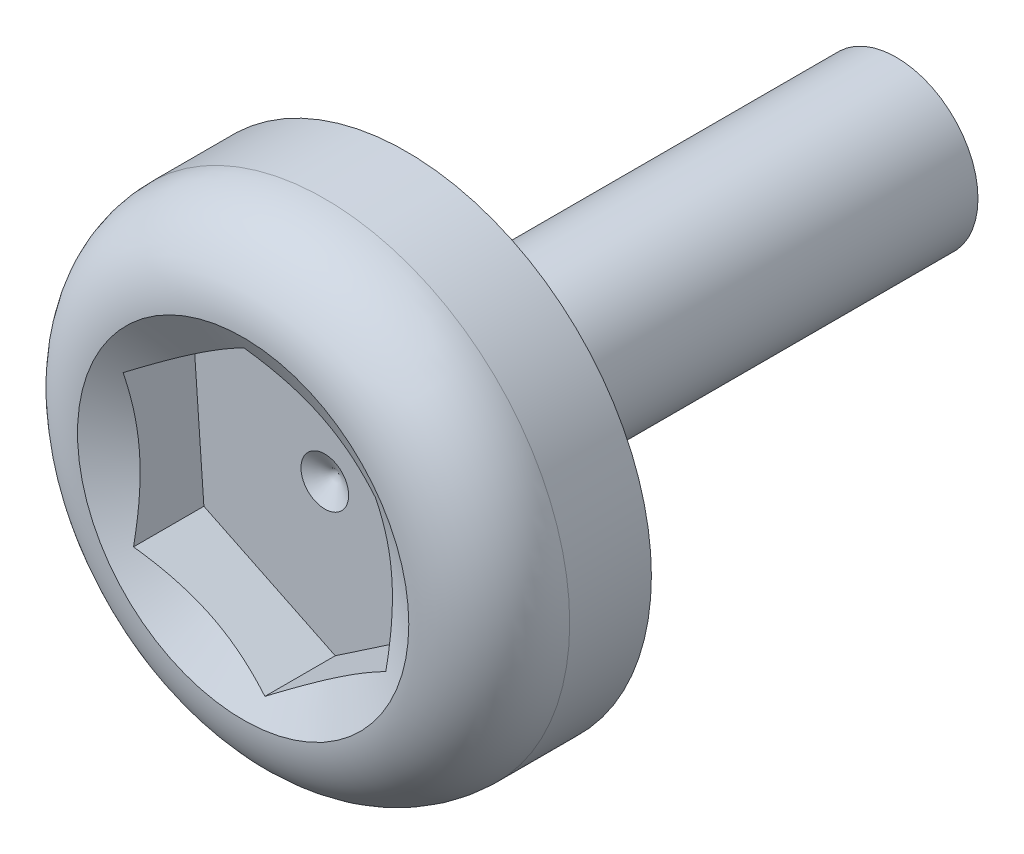
ISO-10303-21;
HEADER;
FILE_DESCRIPTION(('STEP AP214'),'2;1');
FILE_NAME('part.step','',(''),(''),'','','');
FILE_SCHEMA(('AUTOMOTIVE_DESIGN { 1 0 10303 214 1 1 1 1 }'));
ENDSEC;
DATA;
#1=APPLICATION_CONTEXT('core data for automotive mechanical design processes');
#2=APPLICATION_PROTOCOL_DEFINITION('international standard','automotive_design',2000,#1);
#3=PRODUCT_CONTEXT('',#1,'mechanical');
#4=PRODUCT('Part','Part','',(#3));
#5=PRODUCT_RELATED_PRODUCT_CATEGORY('part','',(#4));
#6=PRODUCT_DEFINITION_FORMATION('','',#4);
#7=PRODUCT_DEFINITION_CONTEXT('part definition',#1,'design');
#8=PRODUCT_DEFINITION('design','',#6,#7);
#9=PRODUCT_DEFINITION_SHAPE('','',#8);
#10=(LENGTH_UNIT() NAMED_UNIT(*) SI_UNIT(.MILLI.,.METRE.));
#11=(NAMED_UNIT(*) PLANE_ANGLE_UNIT() SI_UNIT($,.RADIAN.));
#12=(NAMED_UNIT(*) SI_UNIT($,.STERADIAN.) SOLID_ANGLE_UNIT());
#13=UNCERTAINTY_MEASURE_WITH_UNIT(LENGTH_MEASURE(1.E-05),#10,'distance_accuracy_value','');
#14=(GEOMETRIC_REPRESENTATION_CONTEXT(3) GLOBAL_UNCERTAINTY_ASSIGNED_CONTEXT((#13)) GLOBAL_UNIT_ASSIGNED_CONTEXT((#10,
#11,#12)) REPRESENTATION_CONTEXT('',''));
#15=CARTESIAN_POINT('',(0.,0.,0.));
#16=DIRECTION('',(0.,0.,1.));
#17=DIRECTION('',(1.,0.,0.));
#18=AXIS2_PLACEMENT_3D('',#15,#16,#17);
#19=CARTESIAN_POINT('',(0.,0.,3.));
#20=DIRECTION('',(0.,0.,-1.));
#21=DIRECTION('',(-1.,0.,0.));
#22=AXIS2_PLACEMENT_3D('',#19,#20,#21);
#23=CYLINDRICAL_SURFACE('',#22,0.5);
#24=CARTESIAN_POINT('',(0.,0.,3.));
#25=DIRECTION('',(0.,0.,1.));
#26=DIRECTION('',(1.,0.,0.));
#27=AXIS2_PLACEMENT_3D('',#24,#25,#26);
#28=CIRCLE('',#27,0.5);
#29=CARTESIAN_POINT('',(0.5,0.,3.));
#30=VERTEX_POINT('',#29);
#31=EDGE_CURVE('E139',#30,#30,#28,.T.);
#32=ORIENTED_EDGE('',*,*,#31,.F.);
#33=EDGE_LOOP('',(#32));
#34=FACE_BOUND('',#33,.T.);
#35=CARTESIAN_POINT('',(0.,0.,0.));
#36=DIRECTION('',(0.,0.,1.));
#37=DIRECTION('',(1.,0.,0.));
#38=AXIS2_PLACEMENT_3D('',#35,#36,#37);
#39=CIRCLE('',#38,0.5);
#40=CARTESIAN_POINT('',(0.5,0.,0.));
#41=VERTEX_POINT('',#40);
#42=EDGE_CURVE('E138',#41,#41,#39,.T.);
#43=ORIENTED_EDGE('',*,*,#42,.T.);
#44=EDGE_LOOP('',(#43));
#45=FACE_BOUND('',#44,.T.);
#46=ADVANCED_FACE('F35',(#34,#45),#23,.T.);
#47=CARTESIAN_POINT('',(0.,0.,0.));
#48=DIRECTION('',(0.,0.,1.));
#49=DIRECTION('',(1.,0.,0.));
#50=AXIS2_PLACEMENT_3D('',#47,#48,#49);
#51=PLANE('',#50);
#52=ORIENTED_EDGE('',*,*,#42,.F.);
#53=EDGE_LOOP('',(#52));
#54=FACE_BOUND('',#53,.T.);
#55=ADVANCED_FACE('F215',(#54),#51,.F.);
#56=CARTESIAN_POINT('',(0.,0.,4.));
#57=DIRECTION('',(0.,0.,-1.));
#58=DIRECTION('',(-1.,0.,0.));
#59=AXIS2_PLACEMENT_3D('',#56,#57,#58);
#60=CYLINDRICAL_SURFACE('',#59,1.5);
#61=CARTESIAN_POINT('',(0.,0.,3.50020646711625));
#62=DIRECTION('',(0.,0.,1.));
#63=DIRECTION('',(1.,0.,0.));
#64=AXIS2_PLACEMENT_3D('',#61,#62,#63);
#65=CIRCLE('',#64,1.5);
#66=CARTESIAN_POINT('',(1.5,0.,3.50020646711625));
#67=VERTEX_POINT('',#66);
#68=EDGE_CURVE('E11',#67,#67,#65,.F.);
#69=ORIENTED_EDGE('',*,*,#68,.T.);
#70=EDGE_LOOP('',(#69));
#71=FACE_BOUND('',#70,.T.);
#72=CARTESIAN_POINT('',(0.,0.,3.));
#73=DIRECTION('',(0.,0.,1.));
#74=DIRECTION('',(1.,0.,0.));
#75=AXIS2_PLACEMENT_3D('',#72,#73,#74);
#76=CIRCLE('',#75,1.5);
#77=CARTESIAN_POINT('',(1.5,0.,3.));
#78=VERTEX_POINT('',#77);
#79=EDGE_CURVE('E135',#78,#78,#76,.T.);
#80=ORIENTED_EDGE('',*,*,#79,.T.);
#81=EDGE_LOOP('',(#80));
#82=FACE_BOUND('',#81,.T.);
#83=ADVANCED_FACE('F220',(#71,#82),#60,.T.);
#84=CARTESIAN_POINT('',(0.,0.,3.));
#85=DIRECTION('',(0.,0.,1.));
#86=DIRECTION('',(1.,0.,0.));
#87=AXIS2_PLACEMENT_3D('',#84,#85,#86);
#88=PLANE('',#87);
#89=ORIENTED_EDGE('',*,*,#31,.T.);
#90=EDGE_LOOP('',(#89));
#91=FACE_BOUND('',#90,.T.);
#92=ORIENTED_EDGE('',*,*,#79,.F.);
#93=EDGE_LOOP('',(#92));
#94=FACE_BOUND('',#93,.T.);
#95=ADVANCED_FACE('F227',(#91,#94),#88,.F.);
#96=CARTESIAN_POINT('',(0.,0.,4.));
#97=DIRECTION('',(0.,0.,1.));
#98=DIRECTION('',(1.,0.,0.));
#99=AXIS2_PLACEMENT_3D('',#96,#97,#98);
#100=CONICAL_SURFACE('',#99,1.01436748020978,1.04833196437632);
#101=CARTESIAN_POINT('',(-0.804745672472296,0.390392042808868,3.93094067405796));
#102=CARTESIAN_POINT('',(-0.772210209193432,0.412426837229242,3.9196190794136));
#103=CARTESIAN_POINT('',(-0.739395377490517,0.434650835219233,3.90932209945797));
#104=CARTESIAN_POINT('',(-0.673200366959959,0.479481715179159,3.89134669596215));
#105=CARTESIAN_POINT('',(-0.63981902397018,0.502089385583337,3.8836745923592));
#106=CARTESIAN_POINT('',(-0.573467930373446,0.547025973528614,3.87172704806451));
#107=CARTESIAN_POINT('',(-0.540508291496563,0.569348042853309,3.86737260444981));
#108=CARTESIAN_POINT('',(-0.474434211263221,0.614097022204797,3.86216712532911));
#109=CARTESIAN_POINT('',(-0.441320008041255,0.636523770953892,3.86131181890466));
#110=CARTESIAN_POINT('',(-0.379404400696574,0.678456405124771,3.86305793228767));
#111=CARTESIAN_POINT('',(-0.350593947288411,0.697968419217376,3.86523055810879));
#112=CARTESIAN_POINT('',(-0.293159743178299,0.736866002123049,3.87212719387366));
#113=CARTESIAN_POINT('',(-0.26453618950403,0.756251437498201,3.87685355855707));
#114=CARTESIAN_POINT('',(-0.206983593076056,0.795229202153945,3.88867323667547));
#115=CARTESIAN_POINT('',(-0.178061778863407,0.814816635871355,3.895816550869));
#116=CARTESIAN_POINT('',(-0.12064792436806,0.853700436905412,3.91203170981139));
#117=CARTESIAN_POINT('',(-0.0921551538036412,0.872997298808765,3.92109975318976));
#118=CARTESIAN_POINT('',(-0.0638661057786929,0.892156188671039,3.93094067405796));
#119=B_SPLINE_CURVE_WITH_KNOTS('',3,(#101,#102,#103,#104,#105,#106,#107,#108,#109,#110,#111,
#112,#113,#114,#115,#116,#117,#118),.UNSPECIFIED.,.F.,.F.,(4,2,2,2,2,2,2,2,4),(0.,
0.122727997722935,0.245749442791075,0.365740979837626,0.485586015843046,0.590078066125219,
0.694666630787033,0.801566583095681,0.908257338842893),.UNSPECIFIED.);
#120=CARTESIAN_POINT('',(-0.804545672472296,0.39052749374271,3.93087111272209));
#121=VERTEX_POINT('',#120);
#122=CARTESIAN_POINT('',(-0.0640661057786928,0.892020737737198,3.93087111272209));
#123=VERTEX_POINT('',#122);
#124=EDGE_CURVE('E142',#121,#123,#119,.T.);
#125=ORIENTED_EDGE('',*,*,#124,.T.);
#126=CARTESIAN_POINT('',(-0.0642661057786929,0.892117817991832,3.93093513384495));
#127=CARTESIAN_POINT('',(-0.0289159749355394,0.874958819473785,3.91961399409971));
#128=CARTESIAN_POINT('',(0.00673769333866236,0.857652483500251,3.90931749724551));
#129=CARTESIAN_POINT('',(0.078659261984637,0.822741662511001,3.89134309627893));
#130=CARTESIAN_POINT('',(0.114928427056512,0.805136563608243,3.88367151147802));
#131=CARTESIAN_POINT('',(0.187019566682485,0.770143432649409,3.87172499283061));
#132=CARTESIAN_POINT('',(0.222830555914973,0.752760732882426,3.86737105917464));
#133=CARTESIAN_POINT('',(0.294620694767772,0.717913708082116,3.86216656570991));
#134=CARTESIAN_POINT('',(0.330599585721433,0.700449508605908,3.86131173539684));
#135=CARTESIAN_POINT('',(0.397869191554946,0.667796756288573,3.86305860240214));
#136=CARTESIAN_POINT('',(0.429169747552977,0.652603426556152,3.86523132118362));
#137=CARTESIAN_POINT('',(0.491568023855657,0.622315223795121,3.87212770835052));
#138=CARTESIAN_POINT('',(0.522665530167099,0.607220454639087,3.87685373048648));
#139=CARTESIAN_POINT('',(0.585192390055117,0.576869837242024,3.88867233860326));
#140=CARTESIAN_POINT('',(0.616613891926977,0.561617800228461,3.89581491160597));
#141=CARTESIAN_POINT('',(0.678990026406465,0.531340345136598,3.91202830623598));
#142=CARTESIAN_POINT('',(0.709945452168426,0.516314542060175,3.92109532788825));
#143=CARTESIAN_POINT('',(0.740679566693603,0.501396163739854,3.93093513384495));
#144=B_SPLINE_CURVE_WITH_KNOTS('',3,(#126,#127,#128,#129,#130,#131,#132,#133,#134,#135,#136,
#137,#138,#139,#140,#141,#142,#143),.UNSPECIFIED.,.F.,.F.,(4,2,2,2,2,2,2,2,4),(0.,
0.122726680686221,0.24574677291457,0.365737118144795,0.485580976605771,0.590064515948094,
0.694644537699565,0.801535496687152,0.908217322661252),.UNSPECIFIED.);
#145=CARTESIAN_POINT('',(0.740479566693603,0.501493243994488,3.93087111272209));
#146=VERTEX_POINT('',#145);
#147=EDGE_CURVE('E43',#123,#146,#144,.T.);
#148=ORIENTED_EDGE('',*,*,#147,.T.);
#149=CARTESIAN_POINT('',(0.740465202429843,0.501693243994488,3.93092885462633));
#150=CARTESIAN_POINT('',(0.743280112829839,0.462500000997302,3.91960823047951));
#151=CARTESIAN_POINT('',(0.74611919379633,0.422970220508164,3.90931228118956));
#152=CARTESIAN_POINT('',(0.751846264541374,0.343229680499159,3.89133901652285));
#153=CARTESIAN_POINT('',(0.754734355011505,0.303017519005892,3.88366801974832));
#154=CARTESIAN_POINT('',(0.760474927245606,0.223088991790803,3.87172266359843));
#155=CARTESIAN_POINT('',(0.763326534361464,0.183384804181662,3.86736930794272));
#156=CARTESIAN_POINT('',(0.769043136023048,0.103790029853865,3.86216593164029));
#157=CARTESIAN_POINT('',(0.77190810997753,0.0638997298362158,3.86131164095867));
#158=CARTESIAN_POINT('',(0.777264535952246,-0.0106801590383515,3.86305936205839));
#159=CARTESIAN_POINT('',(0.77975677242515,-0.0453806701768752,3.86523218614936));
#160=CARTESIAN_POINT('',(0.784725095379882,-0.114556828982372,3.87212829148486));
#161=CARTESIAN_POINT('',(0.787201164828728,-0.149032239491592,3.87685392535918));
#162=CARTESIAN_POINT('',(0.792179722222949,-0.218350896926474,3.8886713207236));
#163=CARTESIAN_POINT('',(0.794681585138612,-0.253185441286887,3.89581305366917));
#164=CARTESIAN_POINT('',(0.799648142088259,-0.322337011222197,3.91202444865305));
#165=CARTESIAN_POINT('',(0.802112899253178,-0.35665491579703,3.92109031229756));
#166=CARTESIAN_POINT('',(0.804560036736056,-0.39072749374271,3.93092885462633));
#167=B_SPLINE_CURVE_WITH_KNOTS('',3,(#149,#150,#151,#152,#153,#154,#155,#156,#157,#158,#159,
#160,#161,#162,#163,#164,#165,#166),.UNSPECIFIED.,.F.,.F.,(4,2,2,2,2,2,2,2,4),(0.,
0.122725187967656,0.245743746898525,0.365732741337621,0.485575265182602,0.590049157934113,
0.694619496865939,0.80150026258464,0.90817196730253),.UNSPECIFIED.);
#168=CARTESIAN_POINT('',(0.804545672472296,-0.39052749374271,3.93087111272209));
#169=VERTEX_POINT('',#168);
#170=EDGE_CURVE('E175',#146,#169,#167,.T.);
#171=ORIENTED_EDGE('',*,*,#170,.T.);
#172=CARTESIAN_POINT('',(0.804745672472296,-0.390392042808868,3.93094067405796));
#173=CARTESIAN_POINT('',(0.772210209193432,-0.412426837229242,3.9196190794136));
#174=CARTESIAN_POINT('',(0.739395377490517,-0.434650835219233,3.90932209945797));
#175=CARTESIAN_POINT('',(0.67320036695996,-0.479481715179159,3.89134669596216));
#176=CARTESIAN_POINT('',(0.63981902397018,-0.502089385583337,3.8836745923592));
#177=CARTESIAN_POINT('',(0.573467930373446,-0.547025973528614,3.87172704806451));
#178=CARTESIAN_POINT('',(0.540508291496563,-0.569348042853309,3.86737260444981));
#179=CARTESIAN_POINT('',(0.474434211263221,-0.614097022204798,3.86216712532911));
#180=CARTESIAN_POINT('',(0.441320008041255,-0.636523770953893,3.86131181890467));
#181=CARTESIAN_POINT('',(0.379404400696574,-0.678456405124771,3.86305793228767));
#182=CARTESIAN_POINT('',(0.350593947288411,-0.697968419217376,3.86523055810879));
#183=CARTESIAN_POINT('',(0.293159743178299,-0.736866002123049,3.87212719387366));
#184=CARTESIAN_POINT('',(0.26453618950403,-0.756251437498201,3.87685355855707));
#185=CARTESIAN_POINT('',(0.206983593076056,-0.795229202153945,3.88867323667547));
#186=CARTESIAN_POINT('',(0.178061778863407,-0.814816635871355,3.895816550869));
#187=CARTESIAN_POINT('',(0.12064792436806,-0.853700436905412,3.9120317098114));
#188=CARTESIAN_POINT('',(0.0921551538036412,-0.872997298808765,3.92109975318976));
#189=CARTESIAN_POINT('',(0.0638661057786931,-0.892156188671039,3.93094067405796));
#190=B_SPLINE_CURVE_WITH_KNOTS('',3,(#172,#173,#174,#175,#176,#177,#178,#179,#180,#181,#182,
#183,#184,#185,#186,#187,#188,#189),.UNSPECIFIED.,.F.,.F.,(4,2,2,2,2,2,2,2,4),(0.,
0.122727997722935,0.245749442791075,0.365740979837626,0.485586015843046,0.59007806612522,
0.694666630787033,0.801566583095681,0.908257338842892),.UNSPECIFIED.);
#191=CARTESIAN_POINT('',(0.0640661057786931,-0.892020737737198,3.93087111272209));
#192=VERTEX_POINT('',#191);
#193=EDGE_CURVE('E182',#169,#192,#190,.T.);
#194=ORIENTED_EDGE('',*,*,#193,.T.);
#195=CARTESIAN_POINT('',(0.0642661057786931,-0.892117817991832,3.93093513384495));
#196=CARTESIAN_POINT('',(0.0289159749355395,-0.874958819473785,3.91961399409971));
#197=CARTESIAN_POINT('',(-0.00673769333866229,-0.857652483500251,3.90931749724551));
#198=CARTESIAN_POINT('',(-0.0786592619846369,-0.822741662511,3.89134309627893));
#199=CARTESIAN_POINT('',(-0.114928427056512,-0.805136563608243,3.88367151147802));
#200=CARTESIAN_POINT('',(-0.187019566682484,-0.770143432649409,3.87172499283061));
#201=CARTESIAN_POINT('',(-0.222830555914973,-0.752760732882426,3.86737105917464));
#202=CARTESIAN_POINT('',(-0.294620694767771,-0.717913708082116,3.8621665657099));
#203=CARTESIAN_POINT('',(-0.330599585721433,-0.700449508605908,3.86131173539684));
#204=CARTESIAN_POINT('',(-0.397869191554946,-0.667796756288573,3.86305860240214));
#205=CARTESIAN_POINT('',(-0.429169747552976,-0.652603426556152,3.86523132118362));
#206=CARTESIAN_POINT('',(-0.491568023855657,-0.622315223795121,3.87212770835052));
#207=CARTESIAN_POINT('',(-0.522665530167099,-0.607220454639087,3.87685373048648));
#208=CARTESIAN_POINT('',(-0.585192390055117,-0.576869837242024,3.88867233860326));
#209=CARTESIAN_POINT('',(-0.616613891926977,-0.561617800228461,3.89581491160597));
#210=CARTESIAN_POINT('',(-0.678990026406465,-0.531340345136598,3.91202830623598));
#211=CARTESIAN_POINT('',(-0.709945452168426,-0.516314542060175,3.92109532788825));
#212=CARTESIAN_POINT('',(-0.740679566693603,-0.501396163739854,3.93093513384495));
#213=B_SPLINE_CURVE_WITH_KNOTS('',3,(#195,#196,#197,#198,#199,#200,#201,#202,#203,#204,#205,
#206,#207,#208,#209,#210,#211,#212),.UNSPECIFIED.,.F.,.F.,(4,2,2,2,2,2,2,2,4),(0.,
0.122726680686222,0.24574677291457,0.365737118144795,0.48558097660577,0.590064515948094,
0.694644537699565,0.801535496687153,0.908217322661253),.UNSPECIFIED.);
#214=CARTESIAN_POINT('',(-0.740479566693603,-0.501493243994488,3.93087111272209));
#215=VERTEX_POINT('',#214);
#216=EDGE_CURVE('E199',#192,#215,#213,.T.);
#217=ORIENTED_EDGE('',*,*,#216,.T.);
#218=CARTESIAN_POINT('',(-0.740465202429844,-0.501693243994488,3.93092885462633));
#219=CARTESIAN_POINT('',(-0.743280112829839,-0.462500000997302,3.9196082304795));
#220=CARTESIAN_POINT('',(-0.746119193796331,-0.422970220508163,3.90931228118956));
#221=CARTESIAN_POINT('',(-0.751846264541374,-0.343229680499159,3.89133901652285));
#222=CARTESIAN_POINT('',(-0.754734355011505,-0.303017519005891,3.88366801974832));
#223=CARTESIAN_POINT('',(-0.760474927245606,-0.223088991790803,3.87172266359842));
#224=CARTESIAN_POINT('',(-0.763326534361464,-0.183384804181662,3.86736930794272));
#225=CARTESIAN_POINT('',(-0.769043136023048,-0.103790029853865,3.86216593164029));
#226=CARTESIAN_POINT('',(-0.77190810997753,-0.0638997298362159,3.86131164095867));
#227=CARTESIAN_POINT('',(-0.777264535952246,0.0106801590383513,3.86305936205839));
#228=CARTESIAN_POINT('',(-0.77975677242515,0.0453806701768751,3.86523218614936));
#229=CARTESIAN_POINT('',(-0.784725095379882,0.114556828982372,3.87212829148486));
#230=CARTESIAN_POINT('',(-0.787201164828728,0.149032239491592,3.87685392535918));
#231=CARTESIAN_POINT('',(-0.792179722222949,0.218350896926474,3.8886713207236));
#232=CARTESIAN_POINT('',(-0.794681585138612,0.253185441286887,3.89581305366917));
#233=CARTESIAN_POINT('',(-0.799648142088259,0.322337011222196,3.91202444865305));
#234=CARTESIAN_POINT('',(-0.802112899253178,0.35665491579703,3.92109031229756));
#235=CARTESIAN_POINT('',(-0.804560036736056,0.39072749374271,3.93092885462633));
#236=B_SPLINE_CURVE_WITH_KNOTS('',3,(#218,#219,#220,#221,#222,#223,#224,#225,#226,#227,#228,
#229,#230,#231,#232,#233,#234,#235),.UNSPECIFIED.,.F.,.F.,(4,2,2,2,2,2,2,2,4),(0.,
0.122725187967656,0.245743746898525,0.36573274133762,0.485575265182601,0.590049157934112,
0.694619496865938,0.801500262584639,0.908171967302529),.UNSPECIFIED.);
#237=EDGE_CURVE('E153',#215,#121,#236,.T.);
#238=ORIENTED_EDGE('',*,*,#237,.T.);
#239=EDGE_LOOP('',(#125,#148,#171,#194,#217,#238));
#240=FACE_BOUND('',#239,.T.);
#241=CARTESIAN_POINT('',(0.,0.,4.));
#242=DIRECTION('',(0.,0.,1.));
#243=DIRECTION('',(1.,0.,0.));
#244=AXIS2_PLACEMENT_3D('',#241,#242,#243);
#245=CIRCLE('',#244,1.01436748020978);
#246=CARTESIAN_POINT('',(1.01436748020978,0.,4.));
#247=VERTEX_POINT('',#246);
#248=EDGE_CURVE('E132',#247,#247,#245,.T.);
#249=ORIENTED_EDGE('',*,*,#248,.T.);
#250=EDGE_LOOP('',(#249));
#251=FACE_BOUND('',#250,.T.);
#252=ADVANCED_FACE('F159',(#240,#251),#100,.F.);
#253=CARTESIAN_POINT('',(0.740479566693603,0.501493243994488,3.5));
#254=DIRECTION('',(0.436676108457944,0.899618794991538,0.));
#255=DIRECTION('',(-0.899618794991538,0.436676108457944,0.));
#256=AXIS2_PLACEMENT_3D('',#253,#254,#255);
#257=PLANE('',#256);
#258=DIRECTION('',(0.,0.,1.));
#259=VECTOR('',#258,1.);
#260=CARTESIAN_POINT('',(-0.0640661057786929,0.892020737737198,3.5));
#261=LINE('',#260,#259);
#262=CARTESIAN_POINT('',(-0.0640661057786929,0.892020737737198,3.5));
#263=VERTEX_POINT('',#262);
#264=EDGE_CURVE('E50',#263,#123,#261,.T.);
#265=ORIENTED_EDGE('',*,*,#264,.F.);
#266=DIRECTION('',(-0.899618794991537,0.436676108457944,0.));
#267=VECTOR('',#266,1.);
#268=CARTESIAN_POINT('',(0.740479566693603,0.501493243994488,3.5));
#269=LINE('',#268,#267);
#270=CARTESIAN_POINT('',(0.740479566693603,0.501493243994488,3.5));
#271=VERTEX_POINT('',#270);
#272=EDGE_CURVE('E90',#271,#263,#269,.T.);
#273=ORIENTED_EDGE('',*,*,#272,.F.);
#274=DIRECTION('',(0.,0.,1.));
#275=VECTOR('',#274,1.);
#276=CARTESIAN_POINT('',(0.740479566693603,0.501493243994488,3.5));
#277=LINE('',#276,#275);
#278=EDGE_CURVE('E119',#271,#146,#277,.T.);
#279=ORIENTED_EDGE('',*,*,#278,.T.);
#280=ORIENTED_EDGE('',*,*,#147,.F.);
#281=EDGE_LOOP('',(#265,#273,#279,#280));
#282=FACE_BOUND('',#281,.T.);
#283=ADVANCED_FACE('F87',(#282),#257,.F.);
#284=CARTESIAN_POINT('',(0.804545672472296,-0.39052749374271,3.5));
#285=DIRECTION('',(0.997430784413588,0.0716367943454609,0.));
#286=DIRECTION('',(-0.0716367943454609,0.997430784413588,0.));
#287=AXIS2_PLACEMENT_3D('',#284,#285,#286);
#288=PLANE('',#287);
#289=ORIENTED_EDGE('',*,*,#278,.F.);
#290=DIRECTION('',(-0.0716367943454609,0.997430784413588,0.));
#291=VECTOR('',#290,1.);
#292=CARTESIAN_POINT('',(0.804545672472296,-0.39052749374271,3.5));
#293=LINE('',#292,#291);
#294=CARTESIAN_POINT('',(0.804545672472296,-0.39052749374271,3.5));
#295=VERTEX_POINT('',#294);
#296=EDGE_CURVE('E95',#295,#271,#293,.T.);
#297=ORIENTED_EDGE('',*,*,#296,.F.);
#298=DIRECTION('',(0.,0.,1.));
#299=VECTOR('',#298,1.);
#300=CARTESIAN_POINT('',(0.804545672472296,-0.39052749374271,3.5));
#301=LINE('',#300,#299);
#302=EDGE_CURVE('E122',#295,#169,#301,.T.);
#303=ORIENTED_EDGE('',*,*,#302,.T.);
#304=ORIENTED_EDGE('',*,*,#170,.F.);
#305=EDGE_LOOP('',(#289,#297,#303,#304));
#306=FACE_BOUND('',#305,.T.);
#307=ADVANCED_FACE('F170',(#306),#288,.F.);
#308=CARTESIAN_POINT('',(0.0640661057786931,-0.892020737737198,3.5));
#309=DIRECTION('',(0.560754675955645,-0.827982000646077,0.));
#310=DIRECTION('',(0.827982000646077,0.560754675955645,0.));
#311=AXIS2_PLACEMENT_3D('',#308,#309,#310);
#312=PLANE('',#311);
#313=ORIENTED_EDGE('',*,*,#302,.F.);
#314=DIRECTION('',(0.827982000646077,0.560754675955645,0.));
#315=VECTOR('',#314,1.);
#316=CARTESIAN_POINT('',(0.0640661057786931,-0.892020737737198,3.5));
#317=LINE('',#316,#315);
#318=CARTESIAN_POINT('',(0.0640661057786931,-0.892020737737198,3.5));
#319=VERTEX_POINT('',#318);
#320=EDGE_CURVE('E116',#319,#295,#317,.T.);
#321=ORIENTED_EDGE('',*,*,#320,.F.);
#322=DIRECTION('',(0.,0.,1.));
#323=VECTOR('',#322,1.);
#324=CARTESIAN_POINT('',(0.0640661057786931,-0.892020737737198,3.5));
#325=LINE('',#324,#323);
#326=EDGE_CURVE('E125',#319,#192,#325,.T.);
#327=ORIENTED_EDGE('',*,*,#326,.T.);
#328=ORIENTED_EDGE('',*,*,#193,.F.);
#329=EDGE_LOOP('',(#313,#321,#327,#328));
#330=FACE_BOUND('',#329,.T.);
#331=ADVANCED_FACE('F190',(#330),#312,.F.);
#332=CARTESIAN_POINT('',(-0.740479566693603,-0.501493243994488,3.5));
#333=DIRECTION('',(-0.436676108457944,-0.899618794991538,0.));
#334=DIRECTION('',(0.899618794991538,-0.436676108457944,0.));
#335=AXIS2_PLACEMENT_3D('',#332,#333,#334);
#336=PLANE('',#335);
#337=ORIENTED_EDGE('',*,*,#326,.F.);
#338=DIRECTION('',(0.899618794991537,-0.436676108457944,0.));
#339=VECTOR('',#338,1.);
#340=CARTESIAN_POINT('',(-0.740479566693603,-0.501493243994488,3.5));
#341=LINE('',#340,#339);
#342=CARTESIAN_POINT('',(-0.740479566693603,-0.501493243994488,3.5));
#343=VERTEX_POINT('',#342);
#344=EDGE_CURVE('E113',#343,#319,#341,.T.);
#345=ORIENTED_EDGE('',*,*,#344,.F.);
#346=DIRECTION('',(0.,0.,1.));
#347=VECTOR('',#346,1.);
#348=CARTESIAN_POINT('',(-0.740479566693603,-0.501493243994488,3.5));
#349=LINE('',#348,#347);
#350=EDGE_CURVE('E128',#343,#215,#349,.T.);
#351=ORIENTED_EDGE('',*,*,#350,.T.);
#352=ORIENTED_EDGE('',*,*,#216,.F.);
#353=EDGE_LOOP('',(#337,#345,#351,#352));
#354=FACE_BOUND('',#353,.T.);
#355=ADVANCED_FACE('F194',(#354),#336,.F.);
#356=CARTESIAN_POINT('',(-0.804545672472296,0.39052749374271,3.5));
#357=DIRECTION('',(-0.997430784413588,-0.0716367943454606,0.));
#358=DIRECTION('',(0.0716367943454606,-0.997430784413588,0.));
#359=AXIS2_PLACEMENT_3D('',#356,#357,#358);
#360=PLANE('',#359);
#361=ORIENTED_EDGE('',*,*,#350,.F.);
#362=DIRECTION('',(0.0716367943454606,-0.997430784413588,0.));
#363=VECTOR('',#362,1.);
#364=CARTESIAN_POINT('',(-0.804545672472296,0.39052749374271,3.5));
#365=LINE('',#364,#363);
#366=CARTESIAN_POINT('',(-0.804545672472296,0.39052749374271,3.5));
#367=VERTEX_POINT('',#366);
#368=EDGE_CURVE('E104',#367,#343,#365,.T.);
#369=ORIENTED_EDGE('',*,*,#368,.F.);
#370=DIRECTION('',(0.,0.,1.));
#371=VECTOR('',#370,1.);
#372=CARTESIAN_POINT('',(-0.804545672472296,0.39052749374271,3.5));
#373=LINE('',#372,#371);
#374=EDGE_CURVE('E94',#367,#121,#373,.T.);
#375=ORIENTED_EDGE('',*,*,#374,.T.);
#376=ORIENTED_EDGE('',*,*,#237,.F.);
#377=EDGE_LOOP('',(#361,#369,#375,#376));
#378=FACE_BOUND('',#377,.T.);
#379=ADVANCED_FACE('F165',(#378),#360,.F.);
#380=CARTESIAN_POINT('',(-0.0640661057786929,0.892020737737198,3.5));
#381=DIRECTION('',(-0.560754675955645,0.827982000646077,0.));
#382=DIRECTION('',(-0.827982000646077,-0.560754675955645,0.));
#383=AXIS2_PLACEMENT_3D('',#380,#381,#382);
#384=PLANE('',#383);
#385=ORIENTED_EDGE('',*,*,#374,.F.);
#386=DIRECTION('',(-0.827982000646077,-0.560754675955645,0.));
#387=VECTOR('',#386,1.);
#388=CARTESIAN_POINT('',(-0.0640661057786929,0.892020737737198,3.5));
#389=LINE('',#388,#387);
#390=EDGE_CURVE('E98',#263,#367,#389,.T.);
#391=ORIENTED_EDGE('',*,*,#390,.F.);
#392=ORIENTED_EDGE('',*,*,#264,.T.);
#393=ORIENTED_EDGE('',*,*,#124,.F.);
#394=EDGE_LOOP('',(#385,#391,#392,#393));
#395=FACE_BOUND('',#394,.T.);
#396=ADVANCED_FACE('F99',(#395),#384,.F.);
#397=CARTESIAN_POINT('',(0.,0.,3.5));
#398=DIRECTION('',(0.,0.,1.));
#399=DIRECTION('',(1.,0.,0.));
#400=AXIS2_PLACEMENT_3D('',#397,#398,#399);
#401=PLANE('',#400);
#402=ORIENTED_EDGE('',*,*,#272,.T.);
#403=ORIENTED_EDGE('',*,*,#390,.T.);
#404=ORIENTED_EDGE('',*,*,#368,.T.);
#405=ORIENTED_EDGE('',*,*,#344,.T.);
#406=ORIENTED_EDGE('',*,*,#320,.T.);
#407=ORIENTED_EDGE('',*,*,#296,.T.);
#408=EDGE_LOOP('',(#402,#403,#404,#405,#406,#407));
#409=FACE_BOUND('',#408,.T.);
#410=CARTESIAN_POINT('',(0.,0.,3.5));
#411=DIRECTION('',(0.,0.,1.));
#412=DIRECTION('',(1.,0.,0.));
#413=AXIS2_PLACEMENT_3D('',#410,#411,#412);
#414=CIRCLE('',#413,0.146068782383327);
#415=CARTESIAN_POINT('',(0.146068782383326,0.,3.5));
#416=VERTEX_POINT('',#415);
#417=EDGE_CURVE('E121',#416,#416,#414,.F.);
#418=ORIENTED_EDGE('',*,*,#417,.T.);
#419=EDGE_LOOP('',(#418));
#420=FACE_BOUND('',#419,.T.);
#421=ADVANCED_FACE('F106',(#409,#420),#401,.T.);
#422=CARTESIAN_POINT('',(0.,0.,3.41588794112615));
#423=VERTEX_POINT('',#422);
#424=VERTEX_LOOP('',#423);
#425=FACE_BOUND('',#424,.T.);
#426=ORIENTED_EDGE('',*,*,#417,.F.);
#427=EDGE_LOOP('',(#426));
#428=FACE_BOUND('',#427,.T.);
#429=ADVANCED_FACE('F234',(#425,#428),#100,.F.);
#430=CARTESIAN_POINT('',(0.,0.,3.50020646711625));
#431=DIRECTION('',(0.,0.,1.));
#432=DIRECTION('',(1.,0.,0.));
#433=AXIS2_PLACEMENT_3D('',#430,#431,#432);
#434=TOROIDAL_SURFACE('',#433,1.,0.5);
#435=ORIENTED_EDGE('',*,*,#68,.F.);
#436=EDGE_LOOP('',(#435));
#437=FACE_BOUND('',#436,.T.);
#438=ORIENTED_EDGE('',*,*,#248,.F.);
#439=EDGE_LOOP('',(#438));
#440=FACE_BOUND('',#439,.T.);
#441=ADVANCED_FACE('F37',(#437,#440),#434,.T.);
#442=CLOSED_SHELL('',(#46,#55,#83,#95,#252,#283,#307,#331,#355,#379,#396,#421,#429,#441));
#443=MANIFOLD_SOLID_BREP('B2',#442);
#444=ADVANCED_BREP_SHAPE_REPRESENTATION('',(#18,#443),#14);
#445=SHAPE_DEFINITION_REPRESENTATION(#9,#444);
ENDSEC;
END-ISO-10303-21;
